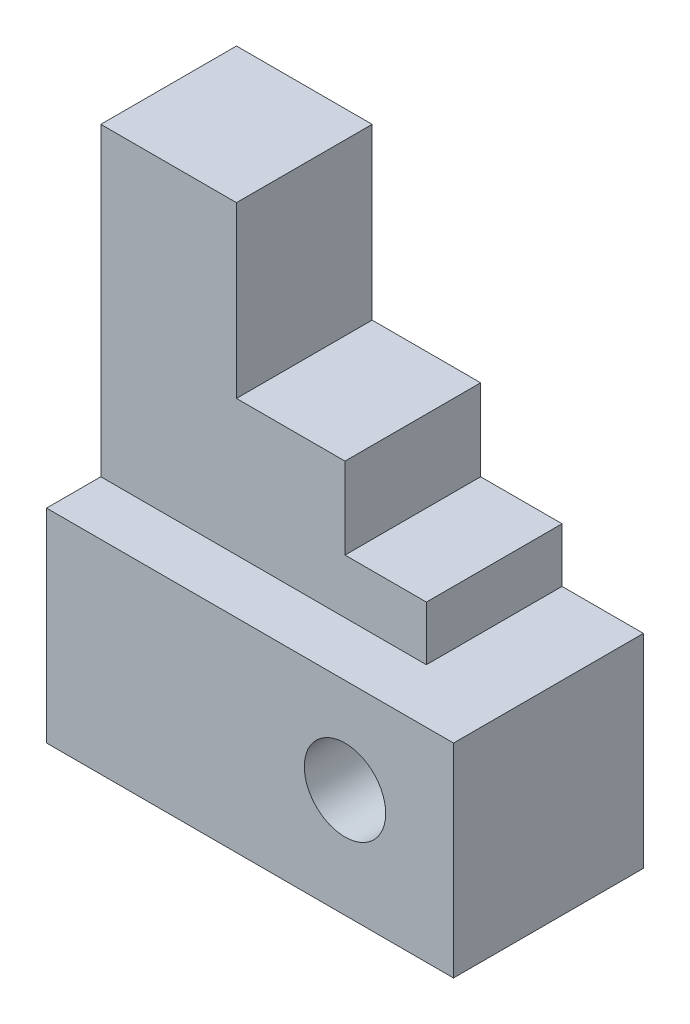
ISO-10303-21;
HEADER;
FILE_DESCRIPTION(('STEP AP214'),'2;1');
FILE_NAME('part.step','',(''),(''),'','','');
FILE_SCHEMA(('AUTOMOTIVE_DESIGN { 1 0 10303 214 1 1 1 1 }'));
ENDSEC;
DATA;
#1=APPLICATION_CONTEXT('core data for automotive mechanical design processes');
#2=APPLICATION_PROTOCOL_DEFINITION('international standard','automotive_design',2000,#1);
#3=PRODUCT_CONTEXT('',#1,'mechanical');
#4=PRODUCT('Part','Part','',(#3));
#5=PRODUCT_RELATED_PRODUCT_CATEGORY('part','',(#4));
#6=PRODUCT_DEFINITION_FORMATION('','',#4);
#7=PRODUCT_DEFINITION_CONTEXT('part definition',#1,'design');
#8=PRODUCT_DEFINITION('design','',#6,#7);
#9=PRODUCT_DEFINITION_SHAPE('','',#8);
#10=(LENGTH_UNIT() NAMED_UNIT(*) SI_UNIT(.MILLI.,.METRE.));
#11=(NAMED_UNIT(*) PLANE_ANGLE_UNIT() SI_UNIT($,.RADIAN.));
#12=(NAMED_UNIT(*) SI_UNIT($,.STERADIAN.) SOLID_ANGLE_UNIT());
#13=UNCERTAINTY_MEASURE_WITH_UNIT(LENGTH_MEASURE(1.E-05),#10,'distance_accuracy_value','');
#14=(GEOMETRIC_REPRESENTATION_CONTEXT(3) GLOBAL_UNCERTAINTY_ASSIGNED_CONTEXT((#13)) GLOBAL_UNIT_ASSIGNED_CONTEXT((#10,
#11,#12)) REPRESENTATION_CONTEXT('',''));
#15=CARTESIAN_POINT('',(0.,0.,0.));
#16=DIRECTION('',(0.,0.,1.));
#17=DIRECTION('',(1.,0.,0.));
#18=AXIS2_PLACEMENT_3D('',#15,#16,#17);
#19=CARTESIAN_POINT('',(0.,30.,28.));
#20=DIRECTION('',(0.,-1.,0.));
#21=DIRECTION('',(0.,0.,-1.));
#22=AXIS2_PLACEMENT_3D('',#19,#20,#21);
#23=PLANE('',#22);
#24=DIRECTION('',(0.,0.,-1.));
#25=VECTOR('',#24,1.);
#26=CARTESIAN_POINT('',(48.,30.,20.));
#27=LINE('',#26,#25);
#28=CARTESIAN_POINT('',(48.,30.,20.));
#29=VERTEX_POINT('',#28);
#30=CARTESIAN_POINT('',(48.,30.,0.));
#31=VERTEX_POINT('',#30);
#32=EDGE_CURVE('E126',#29,#31,#27,.T.);
#33=ORIENTED_EDGE('',*,*,#32,.F.);
#34=DIRECTION('',(1.,0.,0.));
#35=VECTOR('',#34,1.);
#36=CARTESIAN_POINT('',(48.,30.,20.));
#37=LINE('',#36,#35);
#38=CARTESIAN_POINT('',(0.,30.,20.));
#39=VERTEX_POINT('',#38);
#40=EDGE_CURVE('E59',#39,#29,#37,.T.);
#41=ORIENTED_EDGE('',*,*,#40,.F.);
#42=DIRECTION('',(0.,0.,-1.));
#43=VECTOR('',#42,1.);
#44=CARTESIAN_POINT('',(0.,30.,28.));
#45=LINE('',#44,#43);
#46=CARTESIAN_POINT('',(0.,30.,28.));
#47=VERTEX_POINT('',#46);
#48=EDGE_CURVE('E227',#47,#39,#45,.T.);
#49=ORIENTED_EDGE('',*,*,#48,.F.);
#50=DIRECTION('',(-1.,0.,0.));
#51=VECTOR('',#50,1.);
#52=CARTESIAN_POINT('',(0.,30.,28.));
#53=LINE('',#52,#51);
#54=CARTESIAN_POINT('',(60.,30.,28.));
#55=VERTEX_POINT('',#54);
#56=EDGE_CURVE('E224',#55,#47,#53,.T.);
#57=ORIENTED_EDGE('',*,*,#56,.F.);
#58=DIRECTION('',(0.,0.,-1.));
#59=VECTOR('',#58,1.);
#60=CARTESIAN_POINT('',(60.,30.,28.));
#61=LINE('',#60,#59);
#62=CARTESIAN_POINT('',(60.,30.,0.));
#63=VERTEX_POINT('',#62);
#64=EDGE_CURVE('E241',#55,#63,#61,.T.);
#65=ORIENTED_EDGE('',*,*,#64,.T.);
#66=DIRECTION('',(-1.,0.,0.));
#67=VECTOR('',#66,1.);
#68=CARTESIAN_POINT('',(0.,30.,0.));
#69=LINE('',#68,#67);
#70=EDGE_CURVE('E65',#63,#31,#69,.T.);
#71=ORIENTED_EDGE('',*,*,#70,.T.);
#72=EDGE_LOOP('',(#33,#41,#49,#57,#65,#71));
#73=FACE_BOUND('',#72,.T.);
#74=ADVANCED_FACE('F43',(#73),#23,.F.);
#75=CARTESIAN_POINT('',(0.,0.,28.));
#76=DIRECTION('',(0.,0.,-1.));
#77=DIRECTION('',(-1.,0.,0.));
#78=AXIS2_PLACEMENT_3D('',#75,#76,#77);
#79=PLANE('',#78);
#80=DIRECTION('',(0.,-1.,0.));
#81=VECTOR('',#80,1.);
#82=CARTESIAN_POINT('',(0.,0.,28.));
#83=LINE('',#82,#81);
#84=CARTESIAN_POINT('',(0.,0.,28.));
#85=VERTEX_POINT('',#84);
#86=EDGE_CURVE('E214',#47,#85,#83,.T.);
#87=ORIENTED_EDGE('',*,*,#86,.T.);
#88=DIRECTION('',(1.,0.,0.));
#89=VECTOR('',#88,1.);
#90=CARTESIAN_POINT('',(0.,0.,28.));
#91=LINE('',#90,#89);
#92=CARTESIAN_POINT('',(60.,0.,28.));
#93=VERTEX_POINT('',#92);
#94=EDGE_CURVE('E218',#85,#93,#91,.T.);
#95=ORIENTED_EDGE('',*,*,#94,.T.);
#96=DIRECTION('',(0.,1.,0.));
#97=VECTOR('',#96,1.);
#98=CARTESIAN_POINT('',(60.,0.,28.));
#99=LINE('',#98,#97);
#100=EDGE_CURVE('E221',#93,#55,#99,.T.);
#101=ORIENTED_EDGE('',*,*,#100,.T.);
#102=ORIENTED_EDGE('',*,*,#56,.T.);
#103=EDGE_LOOP('',(#87,#95,#101,#102));
#104=FACE_BOUND('',#103,.T.);
#105=CARTESIAN_POINT('',(44.,16.,28.));
#106=DIRECTION('',(0.,0.,1.));
#107=DIRECTION('',(1.,0.,0.));
#108=AXIS2_PLACEMENT_3D('',#105,#106,#107);
#109=CIRCLE('',#108,6.);
#110=CARTESIAN_POINT('',(50.,16.,28.));
#111=VERTEX_POINT('',#110);
#112=EDGE_CURVE('E206',#111,#111,#109,.T.);
#113=ORIENTED_EDGE('',*,*,#112,.F.);
#114=EDGE_LOOP('',(#113));
#115=FACE_BOUND('',#114,.T.);
#116=ADVANCED_FACE('F284',(#104,#115),#79,.F.);
#117=CARTESIAN_POINT('',(0.,0.,0.));
#118=DIRECTION('',(0.,0.,-1.));
#119=DIRECTION('',(-1.,0.,0.));
#120=AXIS2_PLACEMENT_3D('',#117,#118,#119);
#121=PLANE('',#120);
#122=DIRECTION('',(0.,-1.,0.));
#123=VECTOR('',#122,1.);
#124=CARTESIAN_POINT('',(0.,0.,0.));
#125=LINE('',#124,#123);
#126=CARTESIAN_POINT('',(0.,75.,0.));
#127=VERTEX_POINT('',#126);
#128=CARTESIAN_POINT('',(0.,0.,0.));
#129=VERTEX_POINT('',#128);
#130=EDGE_CURVE('E210',#127,#129,#125,.T.);
#131=ORIENTED_EDGE('',*,*,#130,.F.);
#132=DIRECTION('',(-1.,0.,0.));
#133=VECTOR('',#132,1.);
#134=CARTESIAN_POINT('',(0.,75.,0.));
#135=LINE('',#134,#133);
#136=CARTESIAN_POINT('',(20.,75.,0.));
#137=VERTEX_POINT('',#136);
#138=EDGE_CURVE('E147',#137,#127,#135,.T.);
#139=ORIENTED_EDGE('',*,*,#138,.F.);
#140=DIRECTION('',(0.,1.,0.));
#141=VECTOR('',#140,1.);
#142=CARTESIAN_POINT('',(20.,75.,0.));
#143=LINE('',#142,#141);
#144=CARTESIAN_POINT('',(20.,50.,0.));
#145=VERTEX_POINT('',#144);
#146=EDGE_CURVE('E151',#145,#137,#143,.T.);
#147=ORIENTED_EDGE('',*,*,#146,.F.);
#148=DIRECTION('',(-1.,0.,0.));
#149=VECTOR('',#148,1.);
#150=CARTESIAN_POINT('',(20.,50.,0.));
#151=LINE('',#150,#149);
#152=CARTESIAN_POINT('',(36.,50.,0.));
#153=VERTEX_POINT('',#152);
#154=EDGE_CURVE('E180',#153,#145,#151,.T.);
#155=ORIENTED_EDGE('',*,*,#154,.F.);
#156=DIRECTION('',(0.,1.,0.));
#157=VECTOR('',#156,1.);
#158=CARTESIAN_POINT('',(36.,50.,0.));
#159=LINE('',#158,#157);
#160=CARTESIAN_POINT('',(36.,38.,0.));
#161=VERTEX_POINT('',#160);
#162=EDGE_CURVE('E177',#161,#153,#159,.T.);
#163=ORIENTED_EDGE('',*,*,#162,.F.);
#164=DIRECTION('',(-1.,0.,0.));
#165=VECTOR('',#164,1.);
#166=CARTESIAN_POINT('',(36.,38.,0.));
#167=LINE('',#166,#165);
#168=CARTESIAN_POINT('',(48.,38.,0.));
#169=VERTEX_POINT('',#168);
#170=EDGE_CURVE('E174',#169,#161,#167,.T.);
#171=ORIENTED_EDGE('',*,*,#170,.F.);
#172=DIRECTION('',(0.,1.,0.));
#173=VECTOR('',#172,1.);
#174=CARTESIAN_POINT('',(48.,38.,0.));
#175=LINE('',#174,#173);
#176=EDGE_CURVE('E171',#31,#169,#175,.T.);
#177=ORIENTED_EDGE('',*,*,#176,.F.);
#178=ORIENTED_EDGE('',*,*,#70,.F.);
#179=DIRECTION('',(0.,1.,0.));
#180=VECTOR('',#179,1.);
#181=CARTESIAN_POINT('',(60.,0.,0.));
#182=LINE('',#181,#180);
#183=CARTESIAN_POINT('',(60.,0.,0.));
#184=VERTEX_POINT('',#183);
#185=EDGE_CURVE('E234',#184,#63,#182,.T.);
#186=ORIENTED_EDGE('',*,*,#185,.F.);
#187=DIRECTION('',(1.,0.,0.));
#188=VECTOR('',#187,1.);
#189=CARTESIAN_POINT('',(0.,0.,0.));
#190=LINE('',#189,#188);
#191=EDGE_CURVE('E231',#129,#184,#190,.T.);
#192=ORIENTED_EDGE('',*,*,#191,.F.);
#193=EDGE_LOOP('',(#131,#139,#147,#155,#163,#171,#177,#178,#186,#192));
#194=FACE_BOUND('',#193,.T.);
#195=CARTESIAN_POINT('',(44.,16.,0.));
#196=DIRECTION('',(0.,0.,1.));
#197=DIRECTION('',(1.,0.,0.));
#198=AXIS2_PLACEMENT_3D('',#195,#196,#197);
#199=CIRCLE('',#198,6.);
#200=CARTESIAN_POINT('',(50.,16.,0.));
#201=VERTEX_POINT('',#200);
#202=EDGE_CURVE('E130',#201,#201,#199,.T.);
#203=ORIENTED_EDGE('',*,*,#202,.T.);
#204=EDGE_LOOP('',(#203));
#205=FACE_BOUND('',#204,.T.);
#206=ADVANCED_FACE('F253',(#194,#205),#121,.T.);
#207=CARTESIAN_POINT('',(0.,0.,28.));
#208=DIRECTION('',(1.,0.,0.));
#209=DIRECTION('',(0.,0.,-1.));
#210=AXIS2_PLACEMENT_3D('',#207,#208,#209);
#211=PLANE('',#210);
#212=ORIENTED_EDGE('',*,*,#130,.T.);
#213=DIRECTION('',(0.,0.,-1.));
#214=VECTOR('',#213,1.);
#215=CARTESIAN_POINT('',(0.,0.,28.));
#216=LINE('',#215,#214);
#217=EDGE_CURVE('E11',#85,#129,#216,.T.);
#218=ORIENTED_EDGE('',*,*,#217,.F.);
#219=ORIENTED_EDGE('',*,*,#86,.F.);
#220=ORIENTED_EDGE('',*,*,#48,.T.);
#221=DIRECTION('',(0.,-1.,0.));
#222=VECTOR('',#221,1.);
#223=CARTESIAN_POINT('',(0.,30.,20.));
#224=LINE('',#223,#222);
#225=CARTESIAN_POINT('',(0.,75.,20.));
#226=VERTEX_POINT('',#225);
#227=EDGE_CURVE('E145',#226,#39,#224,.T.);
#228=ORIENTED_EDGE('',*,*,#227,.F.);
#229=DIRECTION('',(0.,0.,-1.));
#230=VECTOR('',#229,1.);
#231=CARTESIAN_POINT('',(0.,75.,20.));
#232=LINE('',#231,#230);
#233=EDGE_CURVE('E170',#226,#127,#232,.T.);
#234=ORIENTED_EDGE('',*,*,#233,.T.);
#235=EDGE_LOOP('',(#212,#218,#219,#220,#228,#234));
#236=FACE_BOUND('',#235,.T.);
#237=ADVANCED_FACE('F45',(#236),#211,.F.);
#238=CARTESIAN_POINT('',(0.,0.,28.));
#239=DIRECTION('',(0.,1.,0.));
#240=DIRECTION('',(0.,0.,1.));
#241=AXIS2_PLACEMENT_3D('',#238,#239,#240);
#242=PLANE('',#241);
#243=ORIENTED_EDGE('',*,*,#191,.T.);
#244=DIRECTION('',(0.,0.,-1.));
#245=VECTOR('',#244,1.);
#246=CARTESIAN_POINT('',(60.,0.,28.));
#247=LINE('',#246,#245);
#248=EDGE_CURVE('E52',#93,#184,#247,.T.);
#249=ORIENTED_EDGE('',*,*,#248,.F.);
#250=ORIENTED_EDGE('',*,*,#94,.F.);
#251=ORIENTED_EDGE('',*,*,#217,.T.);
#252=EDGE_LOOP('',(#243,#249,#250,#251));
#253=FACE_BOUND('',#252,.T.);
#254=ADVANCED_FACE('F286',(#253),#242,.F.);
#255=CARTESIAN_POINT('',(60.,0.,28.));
#256=DIRECTION('',(-1.,0.,0.));
#257=DIRECTION('',(0.,0.,1.));
#258=AXIS2_PLACEMENT_3D('',#255,#256,#257);
#259=PLANE('',#258);
#260=ORIENTED_EDGE('',*,*,#185,.T.);
#261=ORIENTED_EDGE('',*,*,#64,.F.);
#262=ORIENTED_EDGE('',*,*,#100,.F.);
#263=ORIENTED_EDGE('',*,*,#248,.T.);
#264=EDGE_LOOP('',(#260,#261,#262,#263));
#265=FACE_BOUND('',#264,.T.);
#266=ADVANCED_FACE('F249',(#265),#259,.F.);
#267=CARTESIAN_POINT('',(44.,16.,28.));
#268=DIRECTION('',(0.,0.,-1.));
#269=DIRECTION('',(-1.,0.,0.));
#270=AXIS2_PLACEMENT_3D('',#267,#268,#269);
#271=CYLINDRICAL_SURFACE('',#270,6.);
#272=ORIENTED_EDGE('',*,*,#112,.T.);
#273=EDGE_LOOP('',(#272));
#274=FACE_BOUND('',#273,.T.);
#275=ORIENTED_EDGE('',*,*,#202,.F.);
#276=EDGE_LOOP('',(#275));
#277=FACE_BOUND('',#276,.T.);
#278=ADVANCED_FACE('F292',(#274,#277),#271,.F.);
#279=CARTESIAN_POINT('',(48.,38.,20.));
#280=DIRECTION('',(-1.,0.,0.));
#281=DIRECTION('',(0.,0.,1.));
#282=AXIS2_PLACEMENT_3D('',#279,#280,#281);
#283=PLANE('',#282);
#284=ORIENTED_EDGE('',*,*,#176,.T.);
#285=DIRECTION('',(0.,0.,-1.));
#286=VECTOR('',#285,1.);
#287=CARTESIAN_POINT('',(48.,38.,20.));
#288=LINE('',#287,#286);
#289=CARTESIAN_POINT('',(48.,38.,20.));
#290=VERTEX_POINT('',#289);
#291=EDGE_CURVE('E131',#290,#169,#288,.T.);
#292=ORIENTED_EDGE('',*,*,#291,.F.);
#293=DIRECTION('',(0.,1.,0.));
#294=VECTOR('',#293,1.);
#295=CARTESIAN_POINT('',(48.,38.,20.));
#296=LINE('',#295,#294);
#297=EDGE_CURVE('E134',#29,#290,#296,.T.);
#298=ORIENTED_EDGE('',*,*,#297,.F.);
#299=ORIENTED_EDGE('',*,*,#32,.T.);
#300=EDGE_LOOP('',(#284,#292,#298,#299));
#301=FACE_BOUND('',#300,.T.);
#302=ADVANCED_FACE('F135',(#301),#283,.F.);
#303=CARTESIAN_POINT('',(36.,38.,20.));
#304=DIRECTION('',(0.,-1.,0.));
#305=DIRECTION('',(1.,0.,0.));
#306=AXIS2_PLACEMENT_3D('',#303,#304,#305);
#307=PLANE('',#306);
#308=ORIENTED_EDGE('',*,*,#170,.T.);
#309=DIRECTION('',(0.,0.,-1.));
#310=VECTOR('',#309,1.);
#311=CARTESIAN_POINT('',(36.,38.,20.));
#312=LINE('',#311,#310);
#313=CARTESIAN_POINT('',(36.,38.,20.));
#314=VERTEX_POINT('',#313);
#315=EDGE_CURVE('E200',#314,#161,#312,.T.);
#316=ORIENTED_EDGE('',*,*,#315,.F.);
#317=DIRECTION('',(-1.,0.,0.));
#318=VECTOR('',#317,1.);
#319=CARTESIAN_POINT('',(36.,38.,20.));
#320=LINE('',#319,#318);
#321=EDGE_CURVE('E140',#290,#314,#320,.T.);
#322=ORIENTED_EDGE('',*,*,#321,.F.);
#323=ORIENTED_EDGE('',*,*,#291,.T.);
#324=EDGE_LOOP('',(#308,#316,#322,#323));
#325=FACE_BOUND('',#324,.T.);
#326=ADVANCED_FACE('F258',(#325),#307,.F.);
#327=CARTESIAN_POINT('',(36.,50.,20.));
#328=DIRECTION('',(-1.,0.,0.));
#329=DIRECTION('',(0.,0.,1.));
#330=AXIS2_PLACEMENT_3D('',#327,#328,#329);
#331=PLANE('',#330);
#332=ORIENTED_EDGE('',*,*,#162,.T.);
#333=DIRECTION('',(0.,0.,-1.));
#334=VECTOR('',#333,1.);
#335=CARTESIAN_POINT('',(36.,50.,20.));
#336=LINE('',#335,#334);
#337=CARTESIAN_POINT('',(36.,50.,20.));
#338=VERTEX_POINT('',#337);
#339=EDGE_CURVE('E196',#338,#153,#336,.T.);
#340=ORIENTED_EDGE('',*,*,#339,.F.);
#341=DIRECTION('',(0.,1.,0.));
#342=VECTOR('',#341,1.);
#343=CARTESIAN_POINT('',(36.,50.,20.));
#344=LINE('',#343,#342);
#345=EDGE_CURVE('E156',#314,#338,#344,.T.);
#346=ORIENTED_EDGE('',*,*,#345,.F.);
#347=ORIENTED_EDGE('',*,*,#315,.T.);
#348=EDGE_LOOP('',(#332,#340,#346,#347));
#349=FACE_BOUND('',#348,.T.);
#350=ADVANCED_FACE('F265',(#349),#331,.F.);
#351=CARTESIAN_POINT('',(20.,50.,20.));
#352=DIRECTION('',(0.,-1.,0.));
#353=DIRECTION('',(0.,0.,-1.));
#354=AXIS2_PLACEMENT_3D('',#351,#352,#353);
#355=PLANE('',#354);
#356=ORIENTED_EDGE('',*,*,#154,.T.);
#357=DIRECTION('',(0.,0.,-1.));
#358=VECTOR('',#357,1.);
#359=CARTESIAN_POINT('',(20.,50.,20.));
#360=LINE('',#359,#358);
#361=CARTESIAN_POINT('',(20.,50.,20.));
#362=VERTEX_POINT('',#361);
#363=EDGE_CURVE('E192',#362,#145,#360,.T.);
#364=ORIENTED_EDGE('',*,*,#363,.F.);
#365=DIRECTION('',(-1.,0.,0.));
#366=VECTOR('',#365,1.);
#367=CARTESIAN_POINT('',(20.,50.,20.));
#368=LINE('',#367,#366);
#369=EDGE_CURVE('E159',#338,#362,#368,.T.);
#370=ORIENTED_EDGE('',*,*,#369,.F.);
#371=ORIENTED_EDGE('',*,*,#339,.T.);
#372=EDGE_LOOP('',(#356,#364,#370,#371));
#373=FACE_BOUND('',#372,.T.);
#374=ADVANCED_FACE('F268',(#373),#355,.F.);
#375=CARTESIAN_POINT('',(20.,75.,20.));
#376=DIRECTION('',(-1.,0.,0.));
#377=DIRECTION('',(0.,-1.,0.));
#378=AXIS2_PLACEMENT_3D('',#375,#376,#377);
#379=PLANE('',#378);
#380=ORIENTED_EDGE('',*,*,#146,.T.);
#381=DIRECTION('',(0.,0.,-1.));
#382=VECTOR('',#381,1.);
#383=CARTESIAN_POINT('',(20.,75.,20.));
#384=LINE('',#383,#382);
#385=CARTESIAN_POINT('',(20.,75.,20.));
#386=VERTEX_POINT('',#385);
#387=EDGE_CURVE('E188',#386,#137,#384,.T.);
#388=ORIENTED_EDGE('',*,*,#387,.F.);
#389=DIRECTION('',(0.,1.,0.));
#390=VECTOR('',#389,1.);
#391=CARTESIAN_POINT('',(20.,75.,20.));
#392=LINE('',#391,#390);
#393=EDGE_CURVE('E162',#362,#386,#392,.T.);
#394=ORIENTED_EDGE('',*,*,#393,.F.);
#395=ORIENTED_EDGE('',*,*,#363,.T.);
#396=EDGE_LOOP('',(#380,#388,#394,#395));
#397=FACE_BOUND('',#396,.T.);
#398=ADVANCED_FACE('F273',(#397),#379,.F.);
#399=CARTESIAN_POINT('',(0.,75.,20.));
#400=DIRECTION('',(0.,-1.,0.));
#401=DIRECTION('',(0.,0.,-1.));
#402=AXIS2_PLACEMENT_3D('',#399,#400,#401);
#403=PLANE('',#402);
#404=ORIENTED_EDGE('',*,*,#138,.T.);
#405=ORIENTED_EDGE('',*,*,#233,.F.);
#406=DIRECTION('',(-1.,0.,0.));
#407=VECTOR('',#406,1.);
#408=CARTESIAN_POINT('',(0.,75.,20.));
#409=LINE('',#408,#407);
#410=EDGE_CURVE('E165',#386,#226,#409,.T.);
#411=ORIENTED_EDGE('',*,*,#410,.F.);
#412=ORIENTED_EDGE('',*,*,#387,.T.);
#413=EDGE_LOOP('',(#404,#405,#411,#412));
#414=FACE_BOUND('',#413,.T.);
#415=ADVANCED_FACE('F277',(#414),#403,.F.);
#416=CARTESIAN_POINT('',(0.,0.,20.));
#417=DIRECTION('',(0.,0.,-1.));
#418=DIRECTION('',(-1.,0.,0.));
#419=AXIS2_PLACEMENT_3D('',#416,#417,#418);
#420=PLANE('',#419);
#421=ORIENTED_EDGE('',*,*,#40,.T.);
#422=ORIENTED_EDGE('',*,*,#297,.T.);
#423=ORIENTED_EDGE('',*,*,#321,.T.);
#424=ORIENTED_EDGE('',*,*,#345,.T.);
#425=ORIENTED_EDGE('',*,*,#369,.T.);
#426=ORIENTED_EDGE('',*,*,#393,.T.);
#427=ORIENTED_EDGE('',*,*,#410,.T.);
#428=ORIENTED_EDGE('',*,*,#227,.T.);
#429=EDGE_LOOP('',(#421,#422,#423,#424,#425,#426,#427,#428));
#430=FACE_BOUND('',#429,.T.);
#431=ADVANCED_FACE('F143',(#430),#420,.F.);
#432=CLOSED_SHELL('',(#74,#116,#206,#237,#254,#266,#278,#302,#326,#350,#374,#398,#415,#431));
#433=MANIFOLD_SOLID_BREP('B2',#432);
#434=ADVANCED_BREP_SHAPE_REPRESENTATION('',(#18,#433),#14);
#435=SHAPE_DEFINITION_REPRESENTATION(#9,#434);
ENDSEC;
END-ISO-10303-21;
